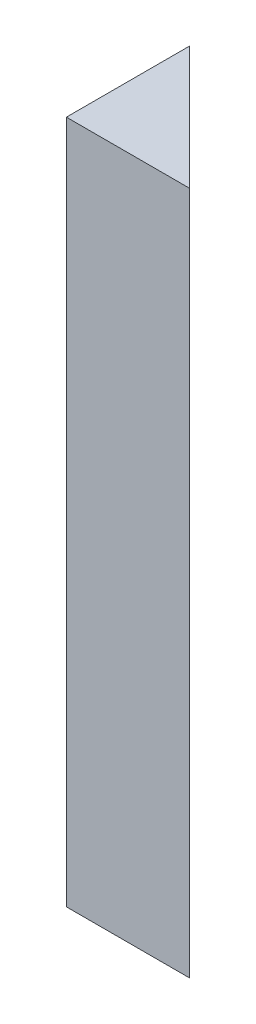
ISO-10303-21;
HEADER;
FILE_DESCRIPTION(('STEP AP214'),'2;1');
FILE_NAME('part.step','',(''),(''),'','','');
FILE_SCHEMA(('AUTOMOTIVE_DESIGN { 1 0 10303 214 1 1 1 1 }'));
ENDSEC;
DATA;
#1=APPLICATION_CONTEXT('core data for automotive mechanical design processes');
#2=APPLICATION_PROTOCOL_DEFINITION('international standard','automotive_design',2000,#1);
#3=PRODUCT_CONTEXT('',#1,'mechanical');
#4=PRODUCT('Part','Part','',(#3));
#5=PRODUCT_RELATED_PRODUCT_CATEGORY('part','',(#4));
#6=PRODUCT_DEFINITION_FORMATION('','',#4);
#7=PRODUCT_DEFINITION_CONTEXT('part definition',#1,'design');
#8=PRODUCT_DEFINITION('design','',#6,#7);
#9=PRODUCT_DEFINITION_SHAPE('','',#8);
#10=(LENGTH_UNIT() NAMED_UNIT(*) SI_UNIT(.MILLI.,.METRE.));
#11=(NAMED_UNIT(*) PLANE_ANGLE_UNIT() SI_UNIT($,.RADIAN.));
#12=(NAMED_UNIT(*) SI_UNIT($,.STERADIAN.) SOLID_ANGLE_UNIT());
#13=UNCERTAINTY_MEASURE_WITH_UNIT(LENGTH_MEASURE(1.E-05),#10,'distance_accuracy_value','');
#14=(GEOMETRIC_REPRESENTATION_CONTEXT(3) GLOBAL_UNCERTAINTY_ASSIGNED_CONTEXT((#13)) GLOBAL_UNIT_ASSIGNED_CONTEXT((#10,
#11,#12)) REPRESENTATION_CONTEXT('',''));
#15=CARTESIAN_POINT('',(0.,0.,0.));
#16=DIRECTION('',(0.,0.,1.));
#17=DIRECTION('',(1.,0.,0.));
#18=AXIS2_PLACEMENT_3D('',#15,#16,#17);
#19=CARTESIAN_POINT('',(0.,111.,0.));
#20=DIRECTION('',(0.707106781186548,0.,-0.707106781186548));
#21=DIRECTION('',(-0.707106781186548,0.,-0.707106781186548));
#22=AXIS2_PLACEMENT_3D('',#19,#20,#21);
#23=PLANE('',#22);
#24=DIRECTION('',(0.707106781186548,0.,0.707106781186547));
#25=VECTOR('',#24,1.);
#26=CARTESIAN_POINT('',(0.,0.,0.));
#27=LINE('',#26,#25);
#28=CARTESIAN_POINT('',(-10.,0.,-9.99999999999999));
#29=VERTEX_POINT('',#28);
#30=CARTESIAN_POINT('',(10.,0.,10.));
#31=VERTEX_POINT('',#30);
#32=EDGE_CURVE('E76',#29,#31,#27,.T.);
#33=ORIENTED_EDGE('',*,*,#32,.F.);
#34=DIRECTION('',(0.,-1.,0.));
#35=VECTOR('',#34,1.);
#36=CARTESIAN_POINT('',(-10.,111.,-9.99999999999999));
#37=LINE('',#36,#35);
#38=CARTESIAN_POINT('',(-10.,111.,-9.99999999999999));
#39=VERTEX_POINT('',#38);
#40=EDGE_CURVE('E11',#39,#29,#37,.T.);
#41=ORIENTED_EDGE('',*,*,#40,.F.);
#42=DIRECTION('',(0.707106781186548,0.,0.707106781186547));
#43=VECTOR('',#42,1.);
#44=CARTESIAN_POINT('',(0.,111.,0.));
#45=LINE('',#44,#43);
#46=CARTESIAN_POINT('',(10.,111.,10.));
#47=VERTEX_POINT('',#46);
#48=EDGE_CURVE('E74',#39,#47,#45,.T.);
#49=ORIENTED_EDGE('',*,*,#48,.T.);
#50=DIRECTION('',(0.,-1.,0.));
#51=VECTOR('',#50,1.);
#52=CARTESIAN_POINT('',(10.,111.,10.));
#53=LINE('',#52,#51);
#54=EDGE_CURVE('E56',#47,#31,#53,.T.);
#55=ORIENTED_EDGE('',*,*,#54,.T.);
#56=EDGE_LOOP('',(#33,#41,#49,#55));
#57=FACE_BOUND('',#56,.T.);
#58=ADVANCED_FACE('F39',(#57),#23,.T.);
#59=CARTESIAN_POINT('',(-10.,111.,0.));
#60=DIRECTION('',(1.,0.,0.));
#61=DIRECTION('',(0.,0.,-1.));
#62=AXIS2_PLACEMENT_3D('',#59,#60,#61);
#63=PLANE('',#62);
#64=DIRECTION('',(0.,0.,1.));
#65=VECTOR('',#64,1.);
#66=CARTESIAN_POINT('',(-10.,0.,0.));
#67=LINE('',#66,#65);
#68=CARTESIAN_POINT('',(-9.99999999999999,0.,10.));
#69=VERTEX_POINT('',#68);
#70=EDGE_CURVE('E91',#29,#69,#67,.T.);
#71=ORIENTED_EDGE('',*,*,#70,.T.);
#72=DIRECTION('',(0.,-1.,0.));
#73=VECTOR('',#72,1.);
#74=CARTESIAN_POINT('',(-9.99999999999999,111.,10.));
#75=LINE('',#74,#73);
#76=CARTESIAN_POINT('',(-9.99999999999999,111.,10.));
#77=VERTEX_POINT('',#76);
#78=EDGE_CURVE('E48',#77,#69,#75,.T.);
#79=ORIENTED_EDGE('',*,*,#78,.F.);
#80=DIRECTION('',(0.,0.,1.));
#81=VECTOR('',#80,1.);
#82=CARTESIAN_POINT('',(-10.,111.,0.));
#83=LINE('',#82,#81);
#84=EDGE_CURVE('E79',#39,#77,#83,.T.);
#85=ORIENTED_EDGE('',*,*,#84,.F.);
#86=ORIENTED_EDGE('',*,*,#40,.T.);
#87=EDGE_LOOP('',(#71,#79,#85,#86));
#88=FACE_BOUND('',#87,.T.);
#89=ADVANCED_FACE('F80',(#88),#63,.F.);
#90=CARTESIAN_POINT('',(0.,111.,10.));
#91=DIRECTION('',(0.,0.,1.));
#92=DIRECTION('',(1.,0.,0.));
#93=AXIS2_PLACEMENT_3D('',#90,#91,#92);
#94=PLANE('',#93);
#95=DIRECTION('',(-1.,0.,0.));
#96=VECTOR('',#95,1.);
#97=CARTESIAN_POINT('',(0.,0.,10.));
#98=LINE('',#97,#96);
#99=EDGE_CURVE('E87',#31,#69,#98,.T.);
#100=ORIENTED_EDGE('',*,*,#99,.F.);
#101=ORIENTED_EDGE('',*,*,#54,.F.);
#102=DIRECTION('',(-1.,0.,0.));
#103=VECTOR('',#102,1.);
#104=CARTESIAN_POINT('',(0.,111.,10.));
#105=LINE('',#104,#103);
#106=EDGE_CURVE('E83',#47,#77,#105,.T.);
#107=ORIENTED_EDGE('',*,*,#106,.T.);
#108=ORIENTED_EDGE('',*,*,#78,.T.);
#109=EDGE_LOOP('',(#100,#101,#107,#108));
#110=FACE_BOUND('',#109,.T.);
#111=ADVANCED_FACE('F104',(#110),#94,.T.);
#112=CARTESIAN_POINT('',(0.,111.,0.));
#113=DIRECTION('',(0.,1.,0.));
#114=DIRECTION('',(0.,0.,1.));
#115=AXIS2_PLACEMENT_3D('',#112,#113,#114);
#116=PLANE('',#115);
#117=ORIENTED_EDGE('',*,*,#48,.F.);
#118=ORIENTED_EDGE('',*,*,#84,.T.);
#119=ORIENTED_EDGE('',*,*,#106,.F.);
#120=EDGE_LOOP('',(#117,#118,#119));
#121=FACE_BOUND('',#120,.T.);
#122=ADVANCED_FACE('F85',(#121),#116,.T.);
#123=CARTESIAN_POINT('',(0.,0.,0.));
#124=DIRECTION('',(0.,1.,0.));
#125=DIRECTION('',(0.,0.,1.));
#126=AXIS2_PLACEMENT_3D('',#123,#124,#125);
#127=PLANE('',#126);
#128=ORIENTED_EDGE('',*,*,#32,.T.);
#129=ORIENTED_EDGE('',*,*,#99,.T.);
#130=ORIENTED_EDGE('',*,*,#70,.F.);
#131=EDGE_LOOP('',(#128,#129,#130));
#132=FACE_BOUND('',#131,.T.);
#133=ADVANCED_FACE('F103',(#132),#127,.F.);
#134=CLOSED_SHELL('',(#58,#89,#111,#122,#133));
#135=MANIFOLD_SOLID_BREP('B2',#134);
#136=ADVANCED_BREP_SHAPE_REPRESENTATION('',(#18,#135),#14);
#137=SHAPE_DEFINITION_REPRESENTATION(#9,#136);
ENDSEC;
END-ISO-10303-21;
